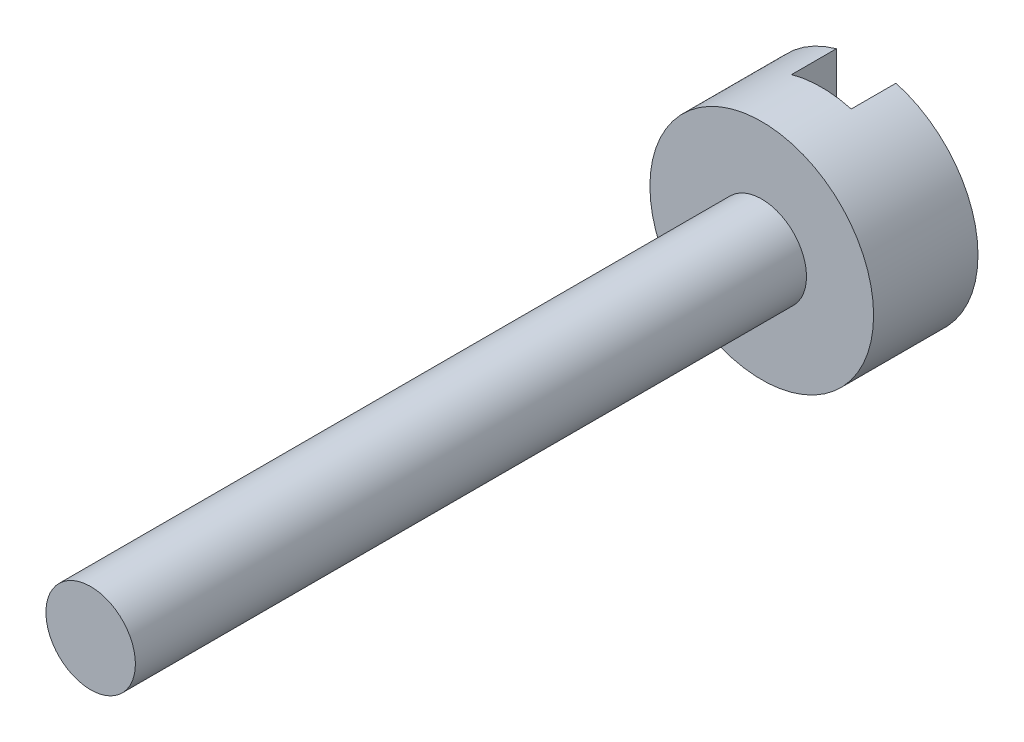
ISO-10303-21;
HEADER;
FILE_DESCRIPTION(('STEP AP214'),'2;1');
FILE_NAME('part.step','',(''),(''),'','','');
FILE_SCHEMA(('AUTOMOTIVE_DESIGN { 1 0 10303 214 1 1 1 1 }'));
ENDSEC;
DATA;
#1=APPLICATION_CONTEXT('core data for automotive mechanical design processes');
#2=APPLICATION_PROTOCOL_DEFINITION('international standard','automotive_design',2000,#1);
#3=PRODUCT_CONTEXT('',#1,'mechanical');
#4=PRODUCT('Part','Part','',(#3));
#5=PRODUCT_RELATED_PRODUCT_CATEGORY('part','',(#4));
#6=PRODUCT_DEFINITION_FORMATION('','',#4);
#7=PRODUCT_DEFINITION_CONTEXT('part definition',#1,'design');
#8=PRODUCT_DEFINITION('design','',#6,#7);
#9=PRODUCT_DEFINITION_SHAPE('','',#8);
#10=(LENGTH_UNIT() NAMED_UNIT(*) SI_UNIT(.MILLI.,.METRE.));
#11=(NAMED_UNIT(*) PLANE_ANGLE_UNIT() SI_UNIT($,.RADIAN.));
#12=(NAMED_UNIT(*) SI_UNIT($,.STERADIAN.) SOLID_ANGLE_UNIT());
#13=UNCERTAINTY_MEASURE_WITH_UNIT(LENGTH_MEASURE(1.E-05),#10,'distance_accuracy_value','');
#14=(GEOMETRIC_REPRESENTATION_CONTEXT(3) GLOBAL_UNCERTAINTY_ASSIGNED_CONTEXT((#13)) GLOBAL_UNIT_ASSIGNED_CONTEXT((#10,
#11,#12)) REPRESENTATION_CONTEXT('',''));
#15=CARTESIAN_POINT('',(0.,0.,0.));
#16=DIRECTION('',(0.,0.,1.));
#17=DIRECTION('',(1.,0.,0.));
#18=AXIS2_PLACEMENT_3D('',#15,#16,#17);
#19=CARTESIAN_POINT('',(0.,0.,0.));
#20=DIRECTION('',(0.,0.,1.));
#21=DIRECTION('',(1.,0.,0.));
#22=AXIS2_PLACEMENT_3D('',#19,#20,#21);
#23=PLANE('',#22);
#24=CARTESIAN_POINT('',(0.,0.,0.));
#25=DIRECTION('',(0.,0.,1.));
#26=DIRECTION('',(1.,0.,0.));
#27=AXIS2_PLACEMENT_3D('',#24,#25,#26);
#28=CIRCLE('',#27,0.75);
#29=CARTESIAN_POINT('',(-0.2,0.722841614740048,0.));
#30=VERTEX_POINT('',#29);
#31=CARTESIAN_POINT('',(-0.2,-0.722841614740048,0.));
#32=VERTEX_POINT('',#31);
#33=EDGE_CURVE('E94',#30,#32,#28,.T.);
#34=ORIENTED_EDGE('',*,*,#33,.F.);
#35=DIRECTION('',(0.,-1.,0.));
#36=VECTOR('',#35,1.);
#37=CARTESIAN_POINT('',(-0.2,0.,0.));
#38=LINE('',#37,#36);
#39=EDGE_CURVE('E82',#30,#32,#38,.T.);
#40=ORIENTED_EDGE('',*,*,#39,.T.);
#41=EDGE_LOOP('',(#34,#40));
#42=FACE_BOUND('',#41,.T.);
#43=ADVANCED_FACE('F35',(#42),#23,.F.);
#44=CARTESIAN_POINT('',(0.,0.,0.7));
#45=DIRECTION('',(0.,0.,1.));
#46=DIRECTION('',(1.,0.,0.));
#47=AXIS2_PLACEMENT_3D('',#44,#45,#46);
#48=PLANE('',#47);
#49=CARTESIAN_POINT('',(0.,0.,0.7));
#50=DIRECTION('',(0.,0.,1.));
#51=DIRECTION('',(1.,0.,0.));
#52=AXIS2_PLACEMENT_3D('',#49,#50,#51);
#53=CIRCLE('',#52,0.75);
#54=CARTESIAN_POINT('',(0.75,0.,0.7));
#55=VERTEX_POINT('',#54);
#56=EDGE_CURVE('E83',#55,#55,#53,.T.);
#57=ORIENTED_EDGE('',*,*,#56,.T.);
#58=EDGE_LOOP('',(#57));
#59=FACE_BOUND('',#58,.T.);
#60=CARTESIAN_POINT('',(0.,0.,0.7));
#61=DIRECTION('',(0.,0.,1.));
#62=DIRECTION('',(1.,0.,0.));
#63=AXIS2_PLACEMENT_3D('',#60,#61,#62);
#64=CIRCLE('',#63,0.3);
#65=CARTESIAN_POINT('',(0.3,0.,0.7));
#66=VERTEX_POINT('',#65);
#67=EDGE_CURVE('E99',#66,#66,#64,.T.);
#68=ORIENTED_EDGE('',*,*,#67,.F.);
#69=EDGE_LOOP('',(#68));
#70=FACE_BOUND('',#69,.T.);
#71=ADVANCED_FACE('F120',(#59,#70),#48,.T.);
#72=CARTESIAN_POINT('',(0.,0.,0.7));
#73=DIRECTION('',(0.,0.,-1.));
#74=DIRECTION('',(-1.,0.,0.));
#75=AXIS2_PLACEMENT_3D('',#72,#73,#74);
#76=CYLINDRICAL_SURFACE('',#75,0.75);
#77=CARTESIAN_POINT('',(0.,0.,0.3));
#78=DIRECTION('',(0.,0.,-1.));
#79=DIRECTION('',(-1.,0.,0.));
#80=AXIS2_PLACEMENT_3D('',#77,#78,#79);
#81=CIRCLE('',#80,0.75);
#82=CARTESIAN_POINT('',(-0.2,0.722841614740048,0.3));
#83=VERTEX_POINT('',#82);
#84=CARTESIAN_POINT('',(0.2,0.722841614740048,0.3));
#85=VERTEX_POINT('',#84);
#86=EDGE_CURVE('E11',#83,#85,#81,.T.);
#87=ORIENTED_EDGE('',*,*,#86,.F.);
#88=DIRECTION('',(0.,0.,-1.));
#89=VECTOR('',#88,1.);
#90=CARTESIAN_POINT('',(-0.2,0.722841614740048,0.7));
#91=LINE('',#90,#89);
#92=EDGE_CURVE('E58',#83,#30,#91,.T.);
#93=ORIENTED_EDGE('',*,*,#92,.T.);
#94=ORIENTED_EDGE('',*,*,#33,.T.);
#95=DIRECTION('',(0.,0.,-1.));
#96=VECTOR('',#95,1.);
#97=CARTESIAN_POINT('',(-0.2,-0.722841614740048,0.7));
#98=LINE('',#97,#96);
#99=CARTESIAN_POINT('',(-0.2,-0.722841614740048,0.3));
#100=VERTEX_POINT('',#99);
#101=EDGE_CURVE('E91',#32,#100,#98,.F.);
#102=ORIENTED_EDGE('',*,*,#101,.T.);
#103=CARTESIAN_POINT('',(0.2,-0.722841614740048,0.3));
#104=VERTEX_POINT('',#103);
#105=EDGE_CURVE('E39',#104,#100,#81,.T.);
#106=ORIENTED_EDGE('',*,*,#105,.F.);
#107=DIRECTION('',(0.,0.,-1.));
#108=VECTOR('',#107,1.);
#109=CARTESIAN_POINT('',(0.2,-0.722841614740048,0.7));
#110=LINE('',#109,#108);
#111=CARTESIAN_POINT('',(0.2,-0.722841614740048,0.));
#112=VERTEX_POINT('',#111);
#113=EDGE_CURVE('E77',#104,#112,#110,.T.);
#114=ORIENTED_EDGE('',*,*,#113,.T.);
#115=CARTESIAN_POINT('',(0.2,0.722841614740048,0.));
#116=VERTEX_POINT('',#115);
#117=EDGE_CURVE('E89',#112,#116,#28,.T.);
#118=ORIENTED_EDGE('',*,*,#117,.T.);
#119=DIRECTION('',(0.,0.,-1.));
#120=VECTOR('',#119,1.);
#121=CARTESIAN_POINT('',(0.2,0.722841614740048,0.7));
#122=LINE('',#121,#120);
#123=EDGE_CURVE('E50',#116,#85,#122,.F.);
#124=ORIENTED_EDGE('',*,*,#123,.T.);
#125=EDGE_LOOP('',(#87,#93,#94,#102,#106,#114,#118,#124));
#126=FACE_BOUND('',#125,.T.);
#127=ORIENTED_EDGE('',*,*,#56,.F.);
#128=EDGE_LOOP('',(#127));
#129=FACE_BOUND('',#128,.T.);
#130=ADVANCED_FACE('F37',(#126,#129),#76,.T.);
#131=ORIENTED_EDGE('',*,*,#117,.F.);
#132=DIRECTION('',(0.,1.,0.));
#133=VECTOR('',#132,1.);
#134=CARTESIAN_POINT('',(0.2,0.,0.));
#135=LINE('',#134,#133);
#136=EDGE_CURVE('E74',#112,#116,#135,.T.);
#137=ORIENTED_EDGE('',*,*,#136,.T.);
#138=EDGE_LOOP('',(#131,#137));
#139=FACE_BOUND('',#138,.T.);
#140=ADVANCED_FACE('F93',(#139),#23,.F.);
#141=CARTESIAN_POINT('',(0.,0.,5.2));
#142=DIRECTION('',(0.,0.,-1.));
#143=DIRECTION('',(-1.,0.,0.));
#144=AXIS2_PLACEMENT_3D('',#141,#142,#143);
#145=CYLINDRICAL_SURFACE('',#144,0.3);
#146=CARTESIAN_POINT('',(0.,0.,5.2));
#147=DIRECTION('',(0.,0.,1.));
#148=DIRECTION('',(1.,0.,0.));
#149=AXIS2_PLACEMENT_3D('',#146,#147,#148);
#150=CIRCLE('',#149,0.3);
#151=CARTESIAN_POINT('',(0.3,0.,5.2));
#152=VERTEX_POINT('',#151);
#153=EDGE_CURVE('E95',#152,#152,#150,.T.);
#154=ORIENTED_EDGE('',*,*,#153,.F.);
#155=EDGE_LOOP('',(#154));
#156=FACE_BOUND('',#155,.T.);
#157=ORIENTED_EDGE('',*,*,#67,.T.);
#158=EDGE_LOOP('',(#157));
#159=FACE_BOUND('',#158,.T.);
#160=ADVANCED_FACE('F118',(#156,#159),#145,.T.);
#161=CARTESIAN_POINT('',(0.,0.,5.2));
#162=DIRECTION('',(0.,0.,1.));
#163=DIRECTION('',(1.,0.,0.));
#164=AXIS2_PLACEMENT_3D('',#161,#162,#163);
#165=PLANE('',#164);
#166=ORIENTED_EDGE('',*,*,#153,.T.);
#167=EDGE_LOOP('',(#166));
#168=FACE_BOUND('',#167,.T.);
#169=ADVANCED_FACE('F135',(#168),#165,.T.);
#170=CARTESIAN_POINT('',(-0.2,-1.,0.3));
#171=DIRECTION('',(0.,0.,-1.));
#172=DIRECTION('',(-1.,0.,0.));
#173=AXIS2_PLACEMENT_3D('',#170,#171,#172);
#174=PLANE('',#173);
#175=ORIENTED_EDGE('',*,*,#86,.T.);
#176=DIRECTION('',(0.,-1.,0.));
#177=VECTOR('',#176,1.);
#178=CARTESIAN_POINT('',(0.2,1.,0.3));
#179=LINE('',#178,#177);
#180=EDGE_CURVE('E109',#85,#104,#179,.T.);
#181=ORIENTED_EDGE('',*,*,#180,.T.);
#182=ORIENTED_EDGE('',*,*,#105,.T.);
#183=DIRECTION('',(0.,1.,0.));
#184=VECTOR('',#183,1.);
#185=CARTESIAN_POINT('',(-0.2,1.,0.3));
#186=LINE('',#185,#184);
#187=EDGE_CURVE('E108',#100,#83,#186,.T.);
#188=ORIENTED_EDGE('',*,*,#187,.T.);
#189=EDGE_LOOP('',(#175,#181,#182,#188));
#190=FACE_BOUND('',#189,.T.);
#191=ADVANCED_FACE('F107',(#190),#174,.T.);
#192=CARTESIAN_POINT('',(-0.2,1.,0.3));
#193=DIRECTION('',(-1.,0.,0.));
#194=DIRECTION('',(0.,-1.,0.));
#195=AXIS2_PLACEMENT_3D('',#192,#193,#194);
#196=PLANE('',#195);
#197=ORIENTED_EDGE('',*,*,#187,.F.);
#198=ORIENTED_EDGE('',*,*,#101,.F.);
#199=ORIENTED_EDGE('',*,*,#39,.F.);
#200=ORIENTED_EDGE('',*,*,#92,.F.);
#201=EDGE_LOOP('',(#197,#198,#199,#200));
#202=FACE_BOUND('',#201,.T.);
#203=ADVANCED_FACE('F110',(#202),#196,.F.);
#204=CARTESIAN_POINT('',(0.2,1.,0.3));
#205=DIRECTION('',(1.,0.,0.));
#206=DIRECTION('',(0.,1.,0.));
#207=AXIS2_PLACEMENT_3D('',#204,#205,#206);
#208=PLANE('',#207);
#209=ORIENTED_EDGE('',*,*,#180,.F.);
#210=ORIENTED_EDGE('',*,*,#123,.F.);
#211=ORIENTED_EDGE('',*,*,#136,.F.);
#212=ORIENTED_EDGE('',*,*,#113,.F.);
#213=EDGE_LOOP('',(#209,#210,#211,#212));
#214=FACE_BOUND('',#213,.T.);
#215=ADVANCED_FACE('F76',(#214),#208,.F.);
#216=CLOSED_SHELL('',(#43,#71,#130,#140,#160,#169,#191,#203,#215));
#217=MANIFOLD_SOLID_BREP('B2',#216);
#218=ADVANCED_BREP_SHAPE_REPRESENTATION('',(#18,#217),#14);
#219=SHAPE_DEFINITION_REPRESENTATION(#9,#218);
ENDSEC;
END-ISO-10303-21;
